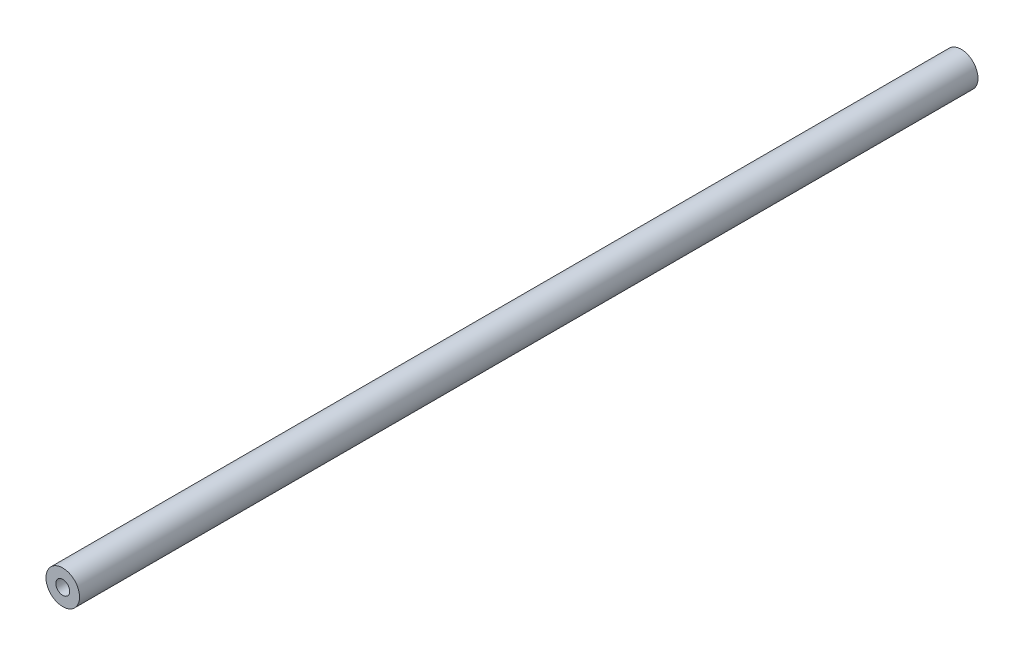
ISO-10303-21;
HEADER;
FILE_DESCRIPTION(('STEP AP214'),'2;1');
FILE_NAME('part.step','',(''),(''),'','','');
FILE_SCHEMA(('AUTOMOTIVE_DESIGN { 1 0 10303 214 1 1 1 1 }'));
ENDSEC;
DATA;
#1=APPLICATION_CONTEXT('core data for automotive mechanical design processes');
#2=APPLICATION_PROTOCOL_DEFINITION('international standard','automotive_design',2000,#1);
#3=PRODUCT_CONTEXT('',#1,'mechanical');
#4=PRODUCT('Part','Part','',(#3));
#5=PRODUCT_RELATED_PRODUCT_CATEGORY('part','',(#4));
#6=PRODUCT_DEFINITION_FORMATION('','',#4);
#7=PRODUCT_DEFINITION_CONTEXT('part definition',#1,'design');
#8=PRODUCT_DEFINITION('design','',#6,#7);
#9=PRODUCT_DEFINITION_SHAPE('','',#8);
#10=(LENGTH_UNIT() NAMED_UNIT(*) SI_UNIT(.MILLI.,.METRE.));
#11=(NAMED_UNIT(*) PLANE_ANGLE_UNIT() SI_UNIT($,.RADIAN.));
#12=(NAMED_UNIT(*) SI_UNIT($,.STERADIAN.) SOLID_ANGLE_UNIT());
#13=UNCERTAINTY_MEASURE_WITH_UNIT(LENGTH_MEASURE(1.E-05),#10,'distance_accuracy_value','');
#14=(GEOMETRIC_REPRESENTATION_CONTEXT(3) GLOBAL_UNCERTAINTY_ASSIGNED_CONTEXT((#13)) GLOBAL_UNIT_ASSIGNED_CONTEXT((#10,
#11,#12)) REPRESENTATION_CONTEXT('',''));
#15=CARTESIAN_POINT('',(0.,0.,0.));
#16=DIRECTION('',(0.,0.,1.));
#17=DIRECTION('',(1.,0.,0.));
#18=AXIS2_PLACEMENT_3D('',#15,#16,#17);
#19=CARTESIAN_POINT('',(0.,0.,107.));
#20=DIRECTION('',(0.,0.,-1.));
#21=DIRECTION('',(-1.,0.,0.));
#22=AXIS2_PLACEMENT_3D('',#19,#20,#21);
#23=CYLINDRICAL_SURFACE('',#22,4.);
#24=CARTESIAN_POINT('',(0.,0.,107.));
#25=DIRECTION('',(0.,0.,1.));
#26=DIRECTION('',(1.,0.,0.));
#27=AXIS2_PLACEMENT_3D('',#24,#25,#26);
#28=CIRCLE('',#27,4.);
#29=CARTESIAN_POINT('',(4.,0.,107.));
#30=VERTEX_POINT('',#29);
#31=EDGE_CURVE('E11',#30,#30,#28,.T.);
#32=ORIENTED_EDGE('',*,*,#31,.F.);
#33=EDGE_LOOP('',(#32));
#34=FACE_BOUND('',#33,.T.);
#35=CARTESIAN_POINT('',(0.,0.,-107.));
#36=DIRECTION('',(0.,0.,1.));
#37=DIRECTION('',(1.,0.,0.));
#38=AXIS2_PLACEMENT_3D('',#35,#36,#37);
#39=CIRCLE('',#38,4.);
#40=CARTESIAN_POINT('',(4.,0.,-107.));
#41=VERTEX_POINT('',#40);
#42=EDGE_CURVE('E42',#41,#41,#39,.T.);
#43=ORIENTED_EDGE('',*,*,#42,.T.);
#44=EDGE_LOOP('',(#43));
#45=FACE_BOUND('',#44,.T.);
#46=ADVANCED_FACE('F39',(#34,#45),#23,.T.);
#47=CARTESIAN_POINT('',(0.,0.,107.));
#48=DIRECTION('',(0.,0.,1.));
#49=DIRECTION('',(1.,0.,0.));
#50=AXIS2_PLACEMENT_3D('',#47,#48,#49);
#51=PLANE('',#50);
#52=CARTESIAN_POINT('',(0.,0.,107.));
#53=DIRECTION('',(0.,0.,1.));
#54=DIRECTION('',(1.,0.,0.));
#55=AXIS2_PLACEMENT_3D('',#52,#53,#54);
#56=CIRCLE('',#55,1.65);
#57=CARTESIAN_POINT('',(1.65,0.,107.));
#58=VERTEX_POINT('',#57);
#59=EDGE_CURVE('E65',#58,#58,#56,.T.);
#60=ORIENTED_EDGE('',*,*,#59,.F.);
#61=EDGE_LOOP('',(#60));
#62=FACE_BOUND('',#61,.T.);
#63=ORIENTED_EDGE('',*,*,#31,.T.);
#64=EDGE_LOOP('',(#63));
#65=FACE_BOUND('',#64,.T.);
#66=ADVANCED_FACE('F90',(#62,#65),#51,.T.);
#67=CARTESIAN_POINT('',(0.,0.,-107.));
#68=DIRECTION('',(0.,0.,1.));
#69=DIRECTION('',(1.,0.,0.));
#70=AXIS2_PLACEMENT_3D('',#67,#68,#69);
#71=PLANE('',#70);
#72=CARTESIAN_POINT('',(0.,0.,-107.));
#73=DIRECTION('',(0.,0.,-1.));
#74=DIRECTION('',(-1.,0.,0.));
#75=AXIS2_PLACEMENT_3D('',#72,#73,#74);
#76=CIRCLE('',#75,1.65);
#77=CARTESIAN_POINT('',(-1.65,0.,-107.));
#78=VERTEX_POINT('',#77);
#79=EDGE_CURVE('E64',#78,#78,#76,.T.);
#80=ORIENTED_EDGE('',*,*,#79,.F.);
#81=EDGE_LOOP('',(#80));
#82=FACE_BOUND('',#81,.T.);
#83=ORIENTED_EDGE('',*,*,#42,.F.);
#84=EDGE_LOOP('',(#83));
#85=FACE_BOUND('',#84,.T.);
#86=ADVANCED_FACE('F87',(#82,#85),#71,.F.);
#87=CARTESIAN_POINT('',(0.,0.,-96.));
#88=DIRECTION('',(0.,0.,-1.));
#89=DIRECTION('',(-1.,0.,0.));
#90=AXIS2_PLACEMENT_3D('',#87,#88,#89);
#91=CONICAL_SURFACE('',#90,1.65,1.02974425867665);
#92=CARTESIAN_POINT('',(0.,0.,-95.0085799786045));
#93=VERTEX_POINT('',#92);
#94=VERTEX_LOOP('',#93);
#95=FACE_BOUND('',#94,.T.);
#96=CARTESIAN_POINT('',(0.,0.,-96.));
#97=DIRECTION('',(0.,0.,-1.));
#98=DIRECTION('',(-1.,0.,0.));
#99=AXIS2_PLACEMENT_3D('',#96,#97,#98);
#100=CIRCLE('',#99,1.65);
#101=CARTESIAN_POINT('',(-1.65,0.,-96.));
#102=VERTEX_POINT('',#101);
#103=EDGE_CURVE('E71',#102,#102,#100,.T.);
#104=ORIENTED_EDGE('',*,*,#103,.T.);
#105=EDGE_LOOP('',(#104));
#106=FACE_BOUND('',#105,.T.);
#107=ADVANCED_FACE('F89',(#95,#106),#91,.F.);
#108=CARTESIAN_POINT('',(0.,0.,-107.));
#109=DIRECTION('',(0.,0.,-1.));
#110=DIRECTION('',(-1.,0.,0.));
#111=AXIS2_PLACEMENT_3D('',#108,#109,#110);
#112=CYLINDRICAL_SURFACE('',#111,1.65);
#113=ORIENTED_EDGE('',*,*,#103,.F.);
#114=EDGE_LOOP('',(#113));
#115=FACE_BOUND('',#114,.T.);
#116=ORIENTED_EDGE('',*,*,#79,.T.);
#117=EDGE_LOOP('',(#116));
#118=FACE_BOUND('',#117,.T.);
#119=ADVANCED_FACE('F57',(#115,#118),#112,.F.);
#120=CARTESIAN_POINT('',(0.,0.,96.));
#121=DIRECTION('',(0.,0.,1.));
#122=DIRECTION('',(1.,0.,0.));
#123=AXIS2_PLACEMENT_3D('',#120,#121,#122);
#124=CONICAL_SURFACE('',#123,1.65,1.02974425867665);
#125=CARTESIAN_POINT('',(0.,0.,95.0085799786045));
#126=VERTEX_POINT('',#125);
#127=VERTEX_LOOP('',#126);
#128=FACE_BOUND('',#127,.T.);
#129=CARTESIAN_POINT('',(0.,0.,96.));
#130=DIRECTION('',(0.,0.,1.));
#131=DIRECTION('',(1.,0.,0.));
#132=AXIS2_PLACEMENT_3D('',#129,#130,#131);
#133=CIRCLE('',#132,1.65);
#134=CARTESIAN_POINT('',(1.65,0.,96.));
#135=VERTEX_POINT('',#134);
#136=EDGE_CURVE('E61',#135,#135,#133,.T.);
#137=ORIENTED_EDGE('',*,*,#136,.T.);
#138=EDGE_LOOP('',(#137));
#139=FACE_BOUND('',#138,.T.);
#140=ADVANCED_FACE('F53',(#128,#139),#124,.F.);
#141=CARTESIAN_POINT('',(0.,0.,107.));
#142=DIRECTION('',(0.,0.,1.));
#143=DIRECTION('',(1.,0.,0.));
#144=AXIS2_PLACEMENT_3D('',#141,#142,#143);
#145=CYLINDRICAL_SURFACE('',#144,1.65);
#146=ORIENTED_EDGE('',*,*,#136,.F.);
#147=EDGE_LOOP('',(#146));
#148=FACE_BOUND('',#147,.T.);
#149=ORIENTED_EDGE('',*,*,#59,.T.);
#150=EDGE_LOOP('',(#149));
#151=FACE_BOUND('',#150,.T.);
#152=ADVANCED_FACE('F56',(#148,#151),#145,.F.);
#153=CLOSED_SHELL('',(#46,#66,#86,#107,#119,#140,#152));
#154=MANIFOLD_SOLID_BREP('B2',#153);
#155=ADVANCED_BREP_SHAPE_REPRESENTATION('',(#18,#154),#14);
#156=SHAPE_DEFINITION_REPRESENTATION(#9,#155);
ENDSEC;
END-ISO-10303-21;
